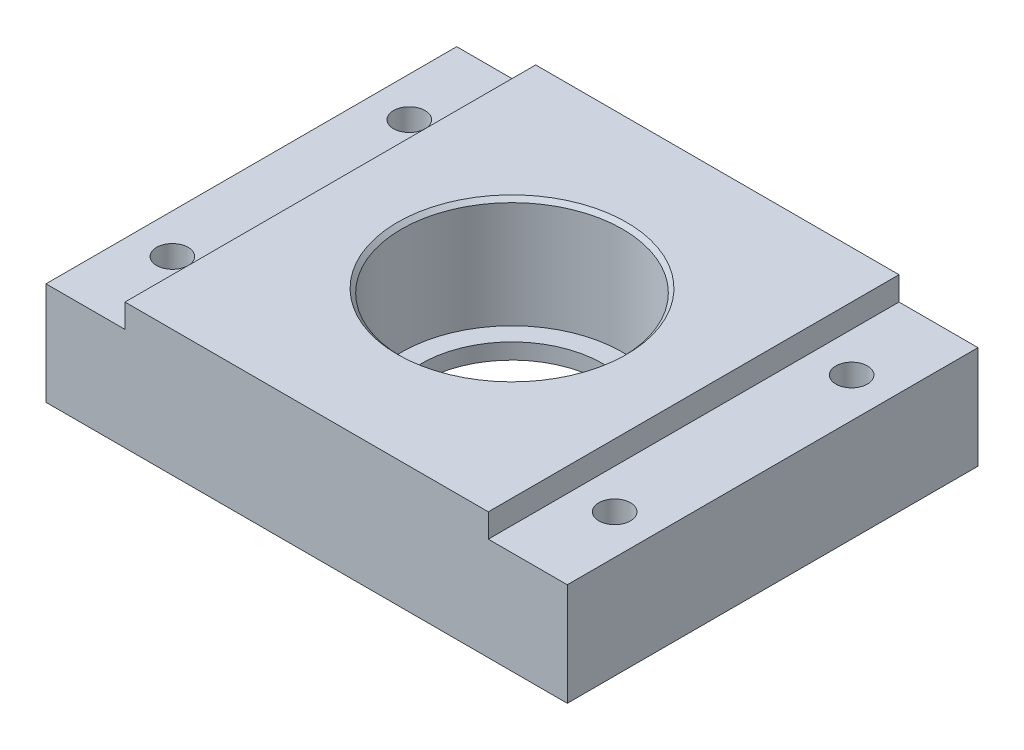
ISO-10303-21;
HEADER;
FILE_DESCRIPTION(('STEP AP214'),'2;1');
FILE_NAME('part.step','',(''),(''),'','','');
FILE_SCHEMA(('AUTOMOTIVE_DESIGN { 1 0 10303 214 1 1 1 1 }'));
ENDSEC;
DATA;
#1=APPLICATION_CONTEXT('core data for automotive mechanical design processes');
#2=APPLICATION_PROTOCOL_DEFINITION('international standard','automotive_design',2000,#1);
#3=PRODUCT_CONTEXT('',#1,'mechanical');
#4=PRODUCT('Part','Part','',(#3));
#5=PRODUCT_RELATED_PRODUCT_CATEGORY('part','',(#4));
#6=PRODUCT_DEFINITION_FORMATION('','',#4);
#7=PRODUCT_DEFINITION_CONTEXT('part definition',#1,'design');
#8=PRODUCT_DEFINITION('design','',#6,#7);
#9=PRODUCT_DEFINITION_SHAPE('','',#8);
#10=(LENGTH_UNIT() NAMED_UNIT(*) SI_UNIT(.MILLI.,.METRE.));
#11=(NAMED_UNIT(*) PLANE_ANGLE_UNIT() SI_UNIT($,.RADIAN.));
#12=(NAMED_UNIT(*) SI_UNIT($,.STERADIAN.) SOLID_ANGLE_UNIT());
#13=UNCERTAINTY_MEASURE_WITH_UNIT(LENGTH_MEASURE(1.E-05),#10,'distance_accuracy_value','');
#14=(GEOMETRIC_REPRESENTATION_CONTEXT(3) GLOBAL_UNCERTAINTY_ASSIGNED_CONTEXT((#13)) GLOBAL_UNIT_ASSIGNED_CONTEXT((#10,
#11,#12)) REPRESENTATION_CONTEXT('',''));
#15=CARTESIAN_POINT('',(0.,0.,0.));
#16=DIRECTION('',(0.,0.,1.));
#17=DIRECTION('',(1.,0.,0.));
#18=AXIS2_PLACEMENT_3D('',#15,#16,#17);
#19=CARTESIAN_POINT('',(0.,16.,0.));
#20=DIRECTION('',(0.,-1.,0.));
#21=DIRECTION('',(0.,0.,-1.));
#22=AXIS2_PLACEMENT_3D('',#19,#20,#21);
#23=CYLINDRICAL_SURFACE('',#22,14.);
#24=CARTESIAN_POINT('',(0.,15.5,0.));
#25=DIRECTION('',(0.,1.,0.));
#26=DIRECTION('',(0.,0.,1.));
#27=AXIS2_PLACEMENT_3D('',#24,#25,#26);
#28=CIRCLE('',#27,14.);
#29=CARTESIAN_POINT('',(0.,15.5,14.));
#30=VERTEX_POINT('',#29);
#31=EDGE_CURVE('E45',#30,#30,#28,.T.);
#32=ORIENTED_EDGE('',*,*,#31,.T.);
#33=EDGE_LOOP('',(#32));
#34=FACE_BOUND('',#33,.T.);
#35=CARTESIAN_POINT('',(0.,2.,0.));
#36=DIRECTION('',(0.,-1.,0.));
#37=DIRECTION('',(0.,0.,-1.));
#38=AXIS2_PLACEMENT_3D('',#35,#36,#37);
#39=CIRCLE('',#38,14.);
#40=CARTESIAN_POINT('',(0.,2.,-14.));
#41=VERTEX_POINT('',#40);
#42=EDGE_CURVE('E134',#41,#41,#39,.T.);
#43=ORIENTED_EDGE('',*,*,#42,.T.);
#44=EDGE_LOOP('',(#43));
#45=FACE_BOUND('',#44,.T.);
#46=ADVANCED_FACE('F37',(#34,#45),#23,.F.);
#47=CARTESIAN_POINT('',(0.,16.,0.));
#48=DIRECTION('',(0.,1.,0.));
#49=DIRECTION('',(0.,0.,1.));
#50=AXIS2_PLACEMENT_3D('',#47,#48,#49);
#51=PLANE('',#50);
#52=DIRECTION('',(0.,0.,1.));
#53=VECTOR('',#52,1.);
#54=CARTESIAN_POINT('',(23.,16.,-26.));
#55=LINE('',#54,#53);
#56=CARTESIAN_POINT('',(23.,16.,-26.));
#57=VERTEX_POINT('',#56);
#58=CARTESIAN_POINT('',(23.,16.,26.));
#59=VERTEX_POINT('',#58);
#60=EDGE_CURVE('E104',#57,#59,#55,.T.);
#61=ORIENTED_EDGE('',*,*,#60,.F.);
#62=DIRECTION('',(-1.,0.,0.));
#63=VECTOR('',#62,1.);
#64=CARTESIAN_POINT('',(25.,16.,-26.));
#65=LINE('',#64,#63);
#66=CARTESIAN_POINT('',(-23.,16.,-26.));
#67=VERTEX_POINT('',#66);
#68=EDGE_CURVE('E118',#57,#67,#65,.T.);
#69=ORIENTED_EDGE('',*,*,#68,.T.);
#70=DIRECTION('',(0.,0.,1.));
#71=VECTOR('',#70,1.);
#72=CARTESIAN_POINT('',(-23.,16.,-26.));
#73=LINE('',#72,#71);
#74=CARTESIAN_POINT('',(-23.,16.,26.));
#75=VERTEX_POINT('',#74);
#76=EDGE_CURVE('E221',#67,#75,#73,.T.);
#77=ORIENTED_EDGE('',*,*,#76,.T.);
#78=DIRECTION('',(1.,0.,0.));
#79=VECTOR('',#78,1.);
#80=CARTESIAN_POINT('',(25.,16.,26.));
#81=LINE('',#80,#79);
#82=EDGE_CURVE('E121',#75,#59,#81,.T.);
#83=ORIENTED_EDGE('',*,*,#82,.T.);
#84=EDGE_LOOP('',(#61,#69,#77,#83));
#85=FACE_BOUND('',#84,.T.);
#86=CARTESIAN_POINT('',(0.,16.,0.));
#87=DIRECTION('',(0.,1.,0.));
#88=DIRECTION('',(0.,0.,1.));
#89=AXIS2_PLACEMENT_3D('',#86,#87,#88);
#90=CIRCLE('',#89,14.5);
#91=CARTESIAN_POINT('',(0.,16.,14.5));
#92=VERTEX_POINT('',#91);
#93=EDGE_CURVE('E11',#92,#92,#90,.F.);
#94=ORIENTED_EDGE('',*,*,#93,.T.);
#95=EDGE_LOOP('',(#94));
#96=FACE_BOUND('',#95,.T.);
#97=ADVANCED_FACE('F115',(#85,#96),#51,.T.);
#98=CARTESIAN_POINT('',(0.,0.,0.));
#99=DIRECTION('',(0.,1.,0.));
#100=DIRECTION('',(0.,0.,1.));
#101=AXIS2_PLACEMENT_3D('',#98,#99,#100);
#102=PLANE('',#101);
#103=CARTESIAN_POINT('',(-28.,0.,15.));
#104=DIRECTION('',(0.,1.,0.));
#105=DIRECTION('',(-1.,0.,0.));
#106=AXIS2_PLACEMENT_3D('',#103,#104,#105);
#107=CIRCLE('',#106,2.);
#108=CARTESIAN_POINT('',(-30.,0.,15.));
#109=VERTEX_POINT('',#108);
#110=EDGE_CURVE('E226',#109,#109,#107,.T.);
#111=ORIENTED_EDGE('',*,*,#110,.T.);
#112=EDGE_LOOP('',(#111));
#113=FACE_BOUND('',#112,.T.);
#114=CARTESIAN_POINT('',(28.,0.,-15.));
#115=DIRECTION('',(0.,1.,0.));
#116=DIRECTION('',(-1.,0.,0.));
#117=AXIS2_PLACEMENT_3D('',#114,#115,#116);
#118=CIRCLE('',#117,2.);
#119=CARTESIAN_POINT('',(26.,0.,-15.));
#120=VERTEX_POINT('',#119);
#121=EDGE_CURVE('E233',#120,#120,#118,.T.);
#122=ORIENTED_EDGE('',*,*,#121,.T.);
#123=EDGE_LOOP('',(#122));
#124=FACE_BOUND('',#123,.T.);
#125=CARTESIAN_POINT('',(28.,0.,15.));
#126=DIRECTION('',(0.,1.,0.));
#127=DIRECTION('',(-1.,0.,0.));
#128=AXIS2_PLACEMENT_3D('',#125,#126,#127);
#129=CIRCLE('',#128,2.);
#130=CARTESIAN_POINT('',(26.,0.,15.));
#131=VERTEX_POINT('',#130);
#132=EDGE_CURVE('E239',#131,#131,#129,.T.);
#133=ORIENTED_EDGE('',*,*,#132,.T.);
#134=EDGE_LOOP('',(#133));
#135=FACE_BOUND('',#134,.T.);
#136=CARTESIAN_POINT('',(-28.,0.,-15.));
#137=DIRECTION('',(0.,1.,0.));
#138=DIRECTION('',(-1.,0.,0.));
#139=AXIS2_PLACEMENT_3D('',#136,#137,#138);
#140=CIRCLE('',#139,2.);
#141=CARTESIAN_POINT('',(-30.,0.,-15.));
#142=VERTEX_POINT('',#141);
#143=EDGE_CURVE('E158',#142,#142,#140,.T.);
#144=ORIENTED_EDGE('',*,*,#143,.T.);
#145=EDGE_LOOP('',(#144));
#146=FACE_BOUND('',#145,.T.);
#147=DIRECTION('',(1.,0.,0.));
#148=VECTOR('',#147,1.);
#149=CARTESIAN_POINT('',(25.,0.,26.));
#150=LINE('',#149,#148);
#151=CARTESIAN_POINT('',(-33.,0.,26.));
#152=VERTEX_POINT('',#151);
#153=CARTESIAN_POINT('',(33.,0.,26.));
#154=VERTEX_POINT('',#153);
#155=EDGE_CURVE('E52',#152,#154,#150,.T.);
#156=ORIENTED_EDGE('',*,*,#155,.F.);
#157=DIRECTION('',(0.,0.,-1.));
#158=VECTOR('',#157,1.);
#159=CARTESIAN_POINT('',(-33.,0.,41.2643375224737));
#160=LINE('',#159,#158);
#161=CARTESIAN_POINT('',(-33.,0.,-26.));
#162=VERTEX_POINT('',#161);
#163=EDGE_CURVE('E146',#152,#162,#160,.T.);
#164=ORIENTED_EDGE('',*,*,#163,.T.);
#165=DIRECTION('',(-1.,0.,0.));
#166=VECTOR('',#165,1.);
#167=CARTESIAN_POINT('',(25.,0.,-26.));
#168=LINE('',#167,#166);
#169=CARTESIAN_POINT('',(33.,0.,-26.));
#170=VERTEX_POINT('',#169);
#171=EDGE_CURVE('E129',#170,#162,#168,.T.);
#172=ORIENTED_EDGE('',*,*,#171,.F.);
#173=DIRECTION('',(0.,0.,-1.));
#174=VECTOR('',#173,1.);
#175=CARTESIAN_POINT('',(33.,0.,41.2643375224737));
#176=LINE('',#175,#174);
#177=EDGE_CURVE('E166',#154,#170,#176,.T.);
#178=ORIENTED_EDGE('',*,*,#177,.F.);
#179=EDGE_LOOP('',(#156,#164,#172,#178));
#180=FACE_BOUND('',#179,.T.);
#181=CARTESIAN_POINT('',(0.,0.,0.));
#182=DIRECTION('',(0.,-1.,0.));
#183=DIRECTION('',(0.,0.,-1.));
#184=AXIS2_PLACEMENT_3D('',#181,#182,#183);
#185=CIRCLE('',#184,11.5);
#186=CARTESIAN_POINT('',(0.,0.,-11.5));
#187=VERTEX_POINT('',#186);
#188=EDGE_CURVE('E175',#187,#187,#185,.T.);
#189=ORIENTED_EDGE('',*,*,#188,.F.);
#190=EDGE_LOOP('',(#189));
#191=FACE_BOUND('',#190,.T.);
#192=ADVANCED_FACE('F147',(#113,#124,#135,#146,#180,#191),#102,.F.);
#193=CARTESIAN_POINT('',(25.,16.,26.));
#194=DIRECTION('',(0.,0.,-1.));
#195=DIRECTION('',(-1.,0.,0.));
#196=AXIS2_PLACEMENT_3D('',#193,#194,#195);
#197=PLANE('',#196);
#198=DIRECTION('',(-1.,0.,0.));
#199=VECTOR('',#198,1.);
#200=CARTESIAN_POINT('',(33.,13.,26.));
#201=LINE('',#200,#199);
#202=CARTESIAN_POINT('',(33.,13.,26.));
#203=VERTEX_POINT('',#202);
#204=CARTESIAN_POINT('',(23.,13.,26.));
#205=VERTEX_POINT('',#204);
#206=EDGE_CURVE('E165',#203,#205,#201,.T.);
#207=ORIENTED_EDGE('',*,*,#206,.T.);
#208=DIRECTION('',(0.,-1.,0.));
#209=VECTOR('',#208,1.);
#210=CARTESIAN_POINT('',(23.,13.,26.));
#211=LINE('',#210,#209);
#212=EDGE_CURVE('E111',#59,#205,#211,.T.);
#213=ORIENTED_EDGE('',*,*,#212,.F.);
#214=ORIENTED_EDGE('',*,*,#82,.F.);
#215=DIRECTION('',(0.,1.,0.));
#216=VECTOR('',#215,1.);
#217=CARTESIAN_POINT('',(-23.,13.,26.));
#218=LINE('',#217,#216);
#219=CARTESIAN_POINT('',(-23.,13.,26.));
#220=VERTEX_POINT('',#219);
#221=EDGE_CURVE('E214',#220,#75,#218,.T.);
#222=ORIENTED_EDGE('',*,*,#221,.F.);
#223=DIRECTION('',(-1.,0.,0.));
#224=VECTOR('',#223,1.);
#225=CARTESIAN_POINT('',(-33.,13.,26.));
#226=LINE('',#225,#224);
#227=CARTESIAN_POINT('',(-33.,13.,26.));
#228=VERTEX_POINT('',#227);
#229=EDGE_CURVE('E169',#220,#228,#226,.T.);
#230=ORIENTED_EDGE('',*,*,#229,.T.);
#231=DIRECTION('',(0.,-1.,0.));
#232=VECTOR('',#231,1.);
#233=CARTESIAN_POINT('',(-33.,0.,26.));
#234=LINE('',#233,#232);
#235=EDGE_CURVE('E162',#228,#152,#234,.T.);
#236=ORIENTED_EDGE('',*,*,#235,.T.);
#237=ORIENTED_EDGE('',*,*,#155,.T.);
#238=DIRECTION('',(0.,1.,0.));
#239=VECTOR('',#238,1.);
#240=CARTESIAN_POINT('',(33.,0.,26.));
#241=LINE('',#240,#239);
#242=EDGE_CURVE('E56',#154,#203,#241,.T.);
#243=ORIENTED_EDGE('',*,*,#242,.T.);
#244=EDGE_LOOP('',(#207,#213,#214,#222,#230,#236,#237,#243));
#245=FACE_BOUND('',#244,.T.);
#246=ADVANCED_FACE('F196',(#245),#197,.F.);
#247=CARTESIAN_POINT('',(25.,16.,-26.));
#248=DIRECTION('',(0.,0.,1.));
#249=DIRECTION('',(1.,0.,0.));
#250=AXIS2_PLACEMENT_3D('',#247,#248,#249);
#251=PLANE('',#250);
#252=DIRECTION('',(0.,-1.,0.));
#253=VECTOR('',#252,1.);
#254=CARTESIAN_POINT('',(23.,13.,-26.));
#255=LINE('',#254,#253);
#256=CARTESIAN_POINT('',(23.,13.,-26.));
#257=VERTEX_POINT('',#256);
#258=EDGE_CURVE('E100',#57,#257,#255,.T.);
#259=ORIENTED_EDGE('',*,*,#258,.T.);
#260=DIRECTION('',(1.,0.,0.));
#261=VECTOR('',#260,1.);
#262=CARTESIAN_POINT('',(33.,13.,-26.));
#263=LINE('',#262,#261);
#264=CARTESIAN_POINT('',(33.,13.,-26.));
#265=VERTEX_POINT('',#264);
#266=EDGE_CURVE('E167',#257,#265,#263,.T.);
#267=ORIENTED_EDGE('',*,*,#266,.T.);
#268=DIRECTION('',(0.,-1.,0.));
#269=VECTOR('',#268,1.);
#270=CARTESIAN_POINT('',(33.,0.,-26.));
#271=LINE('',#270,#269);
#272=EDGE_CURVE('E141',#265,#170,#271,.T.);
#273=ORIENTED_EDGE('',*,*,#272,.T.);
#274=ORIENTED_EDGE('',*,*,#171,.T.);
#275=DIRECTION('',(0.,1.,0.));
#276=VECTOR('',#275,1.);
#277=CARTESIAN_POINT('',(-33.,0.,-26.));
#278=LINE('',#277,#276);
#279=CARTESIAN_POINT('',(-33.,13.,-26.));
#280=VERTEX_POINT('',#279);
#281=EDGE_CURVE('E139',#162,#280,#278,.T.);
#282=ORIENTED_EDGE('',*,*,#281,.T.);
#283=DIRECTION('',(1.,0.,0.));
#284=VECTOR('',#283,1.);
#285=CARTESIAN_POINT('',(-33.,13.,-26.));
#286=LINE('',#285,#284);
#287=CARTESIAN_POINT('',(-23.,13.,-26.));
#288=VERTEX_POINT('',#287);
#289=EDGE_CURVE('E156',#280,#288,#286,.T.);
#290=ORIENTED_EDGE('',*,*,#289,.T.);
#291=DIRECTION('',(0.,1.,0.));
#292=VECTOR('',#291,1.);
#293=CARTESIAN_POINT('',(-23.,13.,-26.));
#294=LINE('',#293,#292);
#295=EDGE_CURVE('E126',#288,#67,#294,.T.);
#296=ORIENTED_EDGE('',*,*,#295,.T.);
#297=ORIENTED_EDGE('',*,*,#68,.F.);
#298=EDGE_LOOP('',(#259,#267,#273,#274,#282,#290,#296,#297));
#299=FACE_BOUND('',#298,.T.);
#300=ADVANCED_FACE('F124',(#299),#251,.F.);
#301=CARTESIAN_POINT('',(0.,2.,0.));
#302=DIRECTION('',(0.,-1.,0.));
#303=DIRECTION('',(0.,0.,-1.));
#304=AXIS2_PLACEMENT_3D('',#301,#302,#303);
#305=PLANE('',#304);
#306=CARTESIAN_POINT('',(0.,2.,0.));
#307=DIRECTION('',(0.,-1.,0.));
#308=DIRECTION('',(0.,0.,-1.));
#309=AXIS2_PLACEMENT_3D('',#306,#307,#308);
#310=CIRCLE('',#309,11.5);
#311=CARTESIAN_POINT('',(0.,2.,-11.5));
#312=VERTEX_POINT('',#311);
#313=EDGE_CURVE('E176',#312,#312,#310,.T.);
#314=ORIENTED_EDGE('',*,*,#313,.T.);
#315=EDGE_LOOP('',(#314));
#316=FACE_BOUND('',#315,.T.);
#317=ORIENTED_EDGE('',*,*,#42,.F.);
#318=EDGE_LOOP('',(#317));
#319=FACE_BOUND('',#318,.T.);
#320=ADVANCED_FACE('F184',(#316,#319),#305,.F.);
#321=CARTESIAN_POINT('',(0.,2.,0.));
#322=DIRECTION('',(0.,-1.,0.));
#323=DIRECTION('',(0.,0.,-1.));
#324=AXIS2_PLACEMENT_3D('',#321,#322,#323);
#325=CYLINDRICAL_SURFACE('',#324,11.5);
#326=ORIENTED_EDGE('',*,*,#313,.F.);
#327=EDGE_LOOP('',(#326));
#328=FACE_BOUND('',#327,.T.);
#329=ORIENTED_EDGE('',*,*,#188,.T.);
#330=EDGE_LOOP('',(#329));
#331=FACE_BOUND('',#330,.T.);
#332=ADVANCED_FACE('F186',(#328,#331),#325,.F.);
#333=CARTESIAN_POINT('',(33.,0.,41.2643375224737));
#334=DIRECTION('',(1.,0.,0.));
#335=DIRECTION('',(0.,0.,-1.));
#336=AXIS2_PLACEMENT_3D('',#333,#334,#335);
#337=PLANE('',#336);
#338=ORIENTED_EDGE('',*,*,#242,.F.);
#339=ORIENTED_EDGE('',*,*,#177,.T.);
#340=ORIENTED_EDGE('',*,*,#272,.F.);
#341=DIRECTION('',(0.,0.,-1.));
#342=VECTOR('',#341,1.);
#343=CARTESIAN_POINT('',(33.,13.,41.2643375224737));
#344=LINE('',#343,#342);
#345=EDGE_CURVE('E171',#203,#265,#344,.T.);
#346=ORIENTED_EDGE('',*,*,#345,.F.);
#347=EDGE_LOOP('',(#338,#339,#340,#346));
#348=FACE_BOUND('',#347,.T.);
#349=ADVANCED_FACE('F193',(#348),#337,.T.);
#350=CARTESIAN_POINT('',(33.,13.,41.2643375224737));
#351=DIRECTION('',(0.,1.,0.));
#352=DIRECTION('',(0.,0.,1.));
#353=AXIS2_PLACEMENT_3D('',#350,#351,#352);
#354=PLANE('',#353);
#355=CARTESIAN_POINT('',(28.,13.,-15.));
#356=DIRECTION('',(0.,1.,0.));
#357=DIRECTION('',(-1.,0.,0.));
#358=AXIS2_PLACEMENT_3D('',#355,#356,#357);
#359=CIRCLE('',#358,2.);
#360=CARTESIAN_POINT('',(26.,13.,-15.));
#361=VERTEX_POINT('',#360);
#362=EDGE_CURVE('E236',#361,#361,#359,.T.);
#363=ORIENTED_EDGE('',*,*,#362,.F.);
#364=EDGE_LOOP('',(#363));
#365=FACE_BOUND('',#364,.T.);
#366=CARTESIAN_POINT('',(28.,13.,15.));
#367=DIRECTION('',(0.,1.,0.));
#368=DIRECTION('',(-1.,0.,0.));
#369=AXIS2_PLACEMENT_3D('',#366,#367,#368);
#370=CIRCLE('',#369,2.);
#371=CARTESIAN_POINT('',(26.,13.,15.));
#372=VERTEX_POINT('',#371);
#373=EDGE_CURVE('E223',#372,#372,#370,.T.);
#374=ORIENTED_EDGE('',*,*,#373,.F.);
#375=EDGE_LOOP('',(#374));
#376=FACE_BOUND('',#375,.T.);
#377=ORIENTED_EDGE('',*,*,#206,.F.);
#378=ORIENTED_EDGE('',*,*,#345,.T.);
#379=ORIENTED_EDGE('',*,*,#266,.F.);
#380=DIRECTION('',(0.,0.,1.));
#381=VECTOR('',#380,1.);
#382=CARTESIAN_POINT('',(23.,13.,-26.));
#383=LINE('',#382,#381);
#384=EDGE_CURVE('E107',#257,#205,#383,.T.);
#385=ORIENTED_EDGE('',*,*,#384,.T.);
#386=EDGE_LOOP('',(#377,#378,#379,#385));
#387=FACE_BOUND('',#386,.T.);
#388=ADVANCED_FACE('F213',(#365,#376,#387),#354,.T.);
#389=CARTESIAN_POINT('',(-33.,13.,41.2643375224737));
#390=DIRECTION('',(0.,1.,0.));
#391=DIRECTION('',(0.,0.,1.));
#392=AXIS2_PLACEMENT_3D('',#389,#390,#391);
#393=PLANE('',#392);
#394=CARTESIAN_POINT('',(-28.,13.,15.));
#395=DIRECTION('',(0.,1.,0.));
#396=DIRECTION('',(-1.,0.,0.));
#397=AXIS2_PLACEMENT_3D('',#394,#395,#396);
#398=CIRCLE('',#397,2.);
#399=CARTESIAN_POINT('',(-30.,13.,15.));
#400=VERTEX_POINT('',#399);
#401=EDGE_CURVE('E230',#400,#400,#398,.T.);
#402=ORIENTED_EDGE('',*,*,#401,.F.);
#403=EDGE_LOOP('',(#402));
#404=FACE_BOUND('',#403,.T.);
#405=CARTESIAN_POINT('',(-28.,13.,-15.));
#406=DIRECTION('',(0.,1.,0.));
#407=DIRECTION('',(-1.,0.,0.));
#408=AXIS2_PLACEMENT_3D('',#405,#406,#407);
#409=CIRCLE('',#408,2.);
#410=CARTESIAN_POINT('',(-30.,13.,-15.));
#411=VERTEX_POINT('',#410);
#412=EDGE_CURVE('E229',#411,#411,#409,.T.);
#413=ORIENTED_EDGE('',*,*,#412,.F.);
#414=EDGE_LOOP('',(#413));
#415=FACE_BOUND('',#414,.T.);
#416=ORIENTED_EDGE('',*,*,#229,.F.);
#417=DIRECTION('',(0.,0.,1.));
#418=VECTOR('',#417,1.);
#419=CARTESIAN_POINT('',(-23.,13.,-26.));
#420=LINE('',#419,#418);
#421=EDGE_CURVE('E219',#288,#220,#420,.T.);
#422=ORIENTED_EDGE('',*,*,#421,.F.);
#423=ORIENTED_EDGE('',*,*,#289,.F.);
#424=DIRECTION('',(0.,0.,-1.));
#425=VECTOR('',#424,1.);
#426=CARTESIAN_POINT('',(-33.,13.,41.2643375224737));
#427=LINE('',#426,#425);
#428=EDGE_CURVE('E151',#228,#280,#427,.T.);
#429=ORIENTED_EDGE('',*,*,#428,.F.);
#430=EDGE_LOOP('',(#416,#422,#423,#429));
#431=FACE_BOUND('',#430,.T.);
#432=ADVANCED_FACE('F251',(#404,#415,#431),#393,.T.);
#433=CARTESIAN_POINT('',(-33.,0.,41.2643375224737));
#434=DIRECTION('',(-1.,0.,0.));
#435=DIRECTION('',(0.,0.,1.));
#436=AXIS2_PLACEMENT_3D('',#433,#434,#435);
#437=PLANE('',#436);
#438=ORIENTED_EDGE('',*,*,#235,.F.);
#439=ORIENTED_EDGE('',*,*,#428,.T.);
#440=ORIENTED_EDGE('',*,*,#281,.F.);
#441=ORIENTED_EDGE('',*,*,#163,.F.);
#442=EDGE_LOOP('',(#438,#439,#440,#441));
#443=FACE_BOUND('',#442,.T.);
#444=ADVANCED_FACE('F153',(#443),#437,.T.);
#445=CARTESIAN_POINT('',(-28.,0.,-15.));
#446=DIRECTION('',(0.,1.,0.));
#447=DIRECTION('',(-1.,0.,0.));
#448=AXIS2_PLACEMENT_3D('',#445,#446,#447);
#449=CYLINDRICAL_SURFACE('',#448,2.);
#450=ORIENTED_EDGE('',*,*,#143,.F.);
#451=EDGE_LOOP('',(#450));
#452=FACE_BOUND('',#451,.T.);
#453=ORIENTED_EDGE('',*,*,#412,.T.);
#454=EDGE_LOOP('',(#453));
#455=FACE_BOUND('',#454,.T.);
#456=ADVANCED_FACE('F268',(#452,#455),#449,.F.);
#457=CARTESIAN_POINT('',(-28.,0.,15.));
#458=DIRECTION('',(0.,1.,0.));
#459=DIRECTION('',(-1.,0.,0.));
#460=AXIS2_PLACEMENT_3D('',#457,#458,#459);
#461=CYLINDRICAL_SURFACE('',#460,2.);
#462=ORIENTED_EDGE('',*,*,#110,.F.);
#463=EDGE_LOOP('',(#462));
#464=FACE_BOUND('',#463,.T.);
#465=ORIENTED_EDGE('',*,*,#401,.T.);
#466=EDGE_LOOP('',(#465));
#467=FACE_BOUND('',#466,.T.);
#468=ADVANCED_FACE('F264',(#464,#467),#461,.F.);
#469=CARTESIAN_POINT('',(28.,0.,15.));
#470=DIRECTION('',(0.,1.,0.));
#471=DIRECTION('',(-1.,0.,0.));
#472=AXIS2_PLACEMENT_3D('',#469,#470,#471);
#473=CYLINDRICAL_SURFACE('',#472,2.);
#474=ORIENTED_EDGE('',*,*,#132,.F.);
#475=EDGE_LOOP('',(#474));
#476=FACE_BOUND('',#475,.T.);
#477=ORIENTED_EDGE('',*,*,#373,.T.);
#478=EDGE_LOOP('',(#477));
#479=FACE_BOUND('',#478,.T.);
#480=ADVANCED_FACE('F267',(#476,#479),#473,.F.);
#481=CARTESIAN_POINT('',(28.,0.,-15.));
#482=DIRECTION('',(0.,1.,0.));
#483=DIRECTION('',(-1.,0.,0.));
#484=AXIS2_PLACEMENT_3D('',#481,#482,#483);
#485=CYLINDRICAL_SURFACE('',#484,2.);
#486=ORIENTED_EDGE('',*,*,#121,.F.);
#487=EDGE_LOOP('',(#486));
#488=FACE_BOUND('',#487,.T.);
#489=ORIENTED_EDGE('',*,*,#362,.T.);
#490=EDGE_LOOP('',(#489));
#491=FACE_BOUND('',#490,.T.);
#492=ADVANCED_FACE('F261',(#488,#491),#485,.F.);
#493=CARTESIAN_POINT('',(0.,15.5,0.));
#494=DIRECTION('',(0.,1.,0.));
#495=DIRECTION('',(0.,0.,1.));
#496=AXIS2_PLACEMENT_3D('',#493,#494,#495);
#497=CONICAL_SURFACE('',#496,14.,0.785398163397448);
#498=ORIENTED_EDGE('',*,*,#93,.F.);
#499=EDGE_LOOP('',(#498));
#500=FACE_BOUND('',#499,.T.);
#501=ORIENTED_EDGE('',*,*,#31,.F.);
#502=EDGE_LOOP('',(#501));
#503=FACE_BOUND('',#502,.T.);
#504=ADVANCED_FACE('F39',(#500,#503),#497,.F.);
#505=CARTESIAN_POINT('',(-23.,13.,-26.));
#506=DIRECTION('',(1.,0.,0.));
#507=DIRECTION('',(0.,0.,-1.));
#508=AXIS2_PLACEMENT_3D('',#505,#506,#507);
#509=PLANE('',#508);
#510=ORIENTED_EDGE('',*,*,#221,.T.);
#511=ORIENTED_EDGE('',*,*,#76,.F.);
#512=ORIENTED_EDGE('',*,*,#295,.F.);
#513=ORIENTED_EDGE('',*,*,#421,.T.);
#514=EDGE_LOOP('',(#510,#511,#512,#513));
#515=FACE_BOUND('',#514,.T.);
#516=ADVANCED_FACE('F253',(#515),#509,.F.);
#517=CARTESIAN_POINT('',(23.,13.,-26.));
#518=DIRECTION('',(-1.,0.,0.));
#519=DIRECTION('',(0.,0.,1.));
#520=AXIS2_PLACEMENT_3D('',#517,#518,#519);
#521=PLANE('',#520);
#522=ORIENTED_EDGE('',*,*,#212,.T.);
#523=ORIENTED_EDGE('',*,*,#384,.F.);
#524=ORIENTED_EDGE('',*,*,#258,.F.);
#525=ORIENTED_EDGE('',*,*,#60,.T.);
#526=EDGE_LOOP('',(#522,#523,#524,#525));
#527=FACE_BOUND('',#526,.T.);
#528=ADVANCED_FACE('F103',(#527),#521,.F.);
#529=CLOSED_SHELL('',(#46,#97,#192,#246,#300,#320,#332,#349,#388,#432,#444,#456,#468,#480,#492,
#504,#516,#528));
#530=MANIFOLD_SOLID_BREP('B2',#529);
#531=ADVANCED_BREP_SHAPE_REPRESENTATION('',(#18,#530),#14);
#532=SHAPE_DEFINITION_REPRESENTATION(#9,#531);
ENDSEC;
END-ISO-10303-21;
